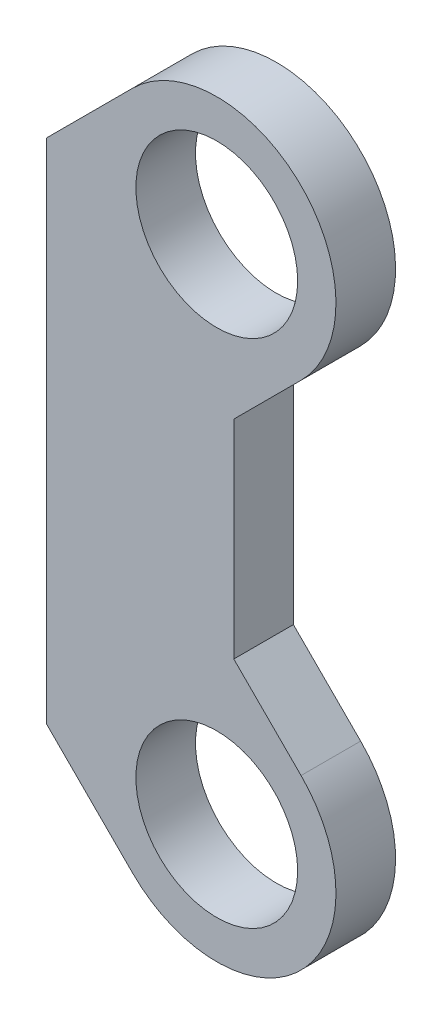
ISO-10303-21;
HEADER;
FILE_DESCRIPTION(('STEP AP214'),'2;1');
FILE_NAME('part.step','',(''),(''),'','','');
FILE_SCHEMA(('AUTOMOTIVE_DESIGN { 1 0 10303 214 1 1 1 1 }'));
ENDSEC;
DATA;
#1=APPLICATION_CONTEXT('core data for automotive mechanical design processes');
#2=APPLICATION_PROTOCOL_DEFINITION('international standard','automotive_design',2000,#1);
#3=PRODUCT_CONTEXT('',#1,'mechanical');
#4=PRODUCT('Part','Part','',(#3));
#5=PRODUCT_RELATED_PRODUCT_CATEGORY('part','',(#4));
#6=PRODUCT_DEFINITION_FORMATION('','',#4);
#7=PRODUCT_DEFINITION_CONTEXT('part definition',#1,'design');
#8=PRODUCT_DEFINITION('design','',#6,#7);
#9=PRODUCT_DEFINITION_SHAPE('','',#8);
#10=(LENGTH_UNIT() NAMED_UNIT(*) SI_UNIT(.MILLI.,.METRE.));
#11=(NAMED_UNIT(*) PLANE_ANGLE_UNIT() SI_UNIT($,.RADIAN.));
#12=(NAMED_UNIT(*) SI_UNIT($,.STERADIAN.) SOLID_ANGLE_UNIT());
#13=UNCERTAINTY_MEASURE_WITH_UNIT(LENGTH_MEASURE(1.E-05),#10,'distance_accuracy_value','');
#14=(GEOMETRIC_REPRESENTATION_CONTEXT(3) GLOBAL_UNCERTAINTY_ASSIGNED_CONTEXT((#13)) GLOBAL_UNIT_ASSIGNED_CONTEXT((#10,
#11,#12)) REPRESENTATION_CONTEXT('',''));
#15=CARTESIAN_POINT('',(0.,0.,0.));
#16=DIRECTION('',(0.,0.,1.));
#17=DIRECTION('',(1.,0.,0.));
#18=AXIS2_PLACEMENT_3D('',#15,#16,#17);
#19=CARTESIAN_POINT('',(-4.94974746830582,-4.94974746830584,3.5));
#20=DIRECTION('',(-0.707106781186546,-0.707106781186549,0.));
#21=DIRECTION('',(0.707106781186549,-0.707106781186546,0.));
#22=AXIS2_PLACEMENT_3D('',#19,#20,#21);
#23=PLANE('',#22);
#24=DIRECTION('',(-0.707106781186549,0.707106781186546,0.));
#25=VECTOR('',#24,1.);
#26=CARTESIAN_POINT('',(-4.94974746830582,-4.94974746830584,3.5));
#27=LINE('',#26,#25);
#28=CARTESIAN_POINT('',(-4.94974746830582,-4.94974746830584,3.5));
#29=VERTEX_POINT('',#28);
#30=CARTESIAN_POINT('',(-10.,0.100505063388337,3.5));
#31=VERTEX_POINT('',#30);
#32=EDGE_CURVE('E121',#29,#31,#27,.T.);
#33=ORIENTED_EDGE('',*,*,#32,.T.);
#34=DIRECTION('',(0.,0.,-1.));
#35=VECTOR('',#34,1.);
#36=CARTESIAN_POINT('',(-10.,0.10050506338834,3.5));
#37=LINE('',#36,#35);
#38=CARTESIAN_POINT('',(-10.,0.100505063388338,0.));
#39=VERTEX_POINT('',#38);
#40=EDGE_CURVE('E157',#31,#39,#37,.T.);
#41=ORIENTED_EDGE('',*,*,#40,.T.);
#42=DIRECTION('',(-0.707106781186549,0.707106781186546,0.));
#43=VECTOR('',#42,1.);
#44=CARTESIAN_POINT('',(-4.94974746830582,-4.94974746830584,0.));
#45=LINE('',#44,#43);
#46=CARTESIAN_POINT('',(-4.94974746830582,-4.94974746830584,0.));
#47=VERTEX_POINT('',#46);
#48=EDGE_CURVE('E164',#47,#39,#45,.T.);
#49=ORIENTED_EDGE('',*,*,#48,.F.);
#50=DIRECTION('',(0.,0.,-1.));
#51=VECTOR('',#50,1.);
#52=CARTESIAN_POINT('',(-4.94974746830582,-4.94974746830584,3.5));
#53=LINE('',#52,#51);
#54=EDGE_CURVE('E133',#29,#47,#53,.T.);
#55=ORIENTED_EDGE('',*,*,#54,.F.);
#56=EDGE_LOOP('',(#33,#41,#49,#55));
#57=FACE_BOUND('',#56,.T.);
#58=ADVANCED_FACE('F41',(#57),#23,.T.);
#59=CARTESIAN_POINT('',(0.,0.,3.5));
#60=DIRECTION('',(0.,0.,1.));
#61=DIRECTION('',(1.,0.,0.));
#62=AXIS2_PLACEMENT_3D('',#59,#60,#61);
#63=PLANE('',#62);
#64=CARTESIAN_POINT('',(0.,0.,3.5));
#65=DIRECTION('',(0.,0.,1.));
#66=DIRECTION('',(1.,0.,0.));
#67=AXIS2_PLACEMENT_3D('',#64,#65,#66);
#68=CIRCLE('',#67,4.75);
#69=CARTESIAN_POINT('',(4.75,0.,3.5));
#70=VERTEX_POINT('',#69);
#71=EDGE_CURVE('E140',#70,#70,#68,.T.);
#72=ORIENTED_EDGE('',*,*,#71,.F.);
#73=EDGE_LOOP('',(#72));
#74=FACE_BOUND('',#73,.T.);
#75=CARTESIAN_POINT('',(0.,30.,3.5));
#76=DIRECTION('',(0.,0.,1.));
#77=DIRECTION('',(1.,0.,0.));
#78=AXIS2_PLACEMENT_3D('',#75,#76,#77);
#79=CIRCLE('',#78,4.75);
#80=CARTESIAN_POINT('',(4.75,30.,3.5));
#81=VERTEX_POINT('',#80);
#82=EDGE_CURVE('E147',#81,#81,#79,.T.);
#83=ORIENTED_EDGE('',*,*,#82,.F.);
#84=EDGE_LOOP('',(#83));
#85=FACE_BOUND('',#84,.T.);
#86=DIRECTION('',(0.707106781186549,0.707106781186546,0.));
#87=VECTOR('',#86,1.);
#88=CARTESIAN_POINT('',(-19.9497474683058,19.9497474683059,3.5));
#89=LINE('',#88,#87);
#90=CARTESIAN_POINT('',(-10.,29.8994949366117,3.5));
#91=VERTEX_POINT('',#90);
#92=CARTESIAN_POINT('',(-4.94974746830582,34.9497474683058,3.5));
#93=VERTEX_POINT('',#92);
#94=EDGE_CURVE('E204',#91,#93,#89,.T.);
#95=ORIENTED_EDGE('',*,*,#94,.F.);
#96=DIRECTION('',(0.,-1.,0.));
#97=VECTOR('',#96,1.);
#98=CARTESIAN_POINT('',(-10.,29.8994949366117,3.5));
#99=LINE('',#98,#97);
#100=EDGE_CURVE('E220',#91,#31,#99,.T.);
#101=ORIENTED_EDGE('',*,*,#100,.T.);
#102=ORIENTED_EDGE('',*,*,#32,.F.);
#103=CARTESIAN_POINT('',(0.,0.,3.5));
#104=DIRECTION('',(0.,0.,1.));
#105=DIRECTION('',(1.,0.,0.));
#106=AXIS2_PLACEMENT_3D('',#103,#104,#105);
#107=CIRCLE('',#106,7.);
#108=CARTESIAN_POINT('',(4.94974746830582,4.94974746830584,3.5));
#109=VERTEX_POINT('',#108);
#110=EDGE_CURVE('E112',#29,#109,#107,.T.);
#111=ORIENTED_EDGE('',*,*,#110,.T.);
#112=DIRECTION('',(-0.707106781186549,0.707106781186546,0.));
#113=VECTOR('',#112,1.);
#114=CARTESIAN_POINT('',(4.94974746830582,4.94974746830585,3.5));
#115=LINE('',#114,#113);
#116=CARTESIAN_POINT('',(0.999999999999977,8.89949493661167,3.5));
#117=VERTEX_POINT('',#116);
#118=EDGE_CURVE('E117',#109,#117,#115,.T.);
#119=ORIENTED_EDGE('',*,*,#118,.T.);
#120=DIRECTION('',(0.,1.,0.));
#121=VECTOR('',#120,1.);
#122=CARTESIAN_POINT('',(0.999999999999977,0.,3.5));
#123=LINE('',#122,#121);
#124=CARTESIAN_POINT('',(0.999999999999977,21.1005050633883,3.5));
#125=VERTEX_POINT('',#124);
#126=EDGE_CURVE('E65',#117,#125,#123,.T.);
#127=ORIENTED_EDGE('',*,*,#126,.T.);
#128=DIRECTION('',(0.707106781186549,0.707106781186546,0.));
#129=VECTOR('',#128,1.);
#130=CARTESIAN_POINT('',(-10.0502525316942,10.0502525316942,3.5));
#131=LINE('',#130,#129);
#132=CARTESIAN_POINT('',(4.94974746830582,25.0502525316942,3.5));
#133=VERTEX_POINT('',#132);
#134=EDGE_CURVE('E183',#125,#133,#131,.T.);
#135=ORIENTED_EDGE('',*,*,#134,.T.);
#136=CARTESIAN_POINT('',(0.,30.,3.5));
#137=DIRECTION('',(0.,0.,1.));
#138=DIRECTION('',(1.,0.,0.));
#139=AXIS2_PLACEMENT_3D('',#136,#137,#138);
#140=CIRCLE('',#139,7.);
#141=EDGE_CURVE('E101',#133,#93,#140,.T.);
#142=ORIENTED_EDGE('',*,*,#141,.T.);
#143=EDGE_LOOP('',(#95,#101,#102,#111,#119,#127,#135,#142));
#144=FACE_BOUND('',#143,.T.);
#145=ADVANCED_FACE('F115',(#74,#85,#144),#63,.T.);
#146=CARTESIAN_POINT('',(0.,0.,0.));
#147=DIRECTION('',(0.,0.,1.));
#148=DIRECTION('',(1.,0.,0.));
#149=AXIS2_PLACEMENT_3D('',#146,#147,#148);
#150=PLANE('',#149);
#151=CARTESIAN_POINT('',(0.,30.,0.));
#152=DIRECTION('',(0.,0.,1.));
#153=DIRECTION('',(1.,0.,0.));
#154=AXIS2_PLACEMENT_3D('',#151,#152,#153);
#155=CIRCLE('',#154,4.75);
#156=CARTESIAN_POINT('',(4.75,30.,0.));
#157=VERTEX_POINT('',#156);
#158=EDGE_CURVE('E179',#157,#157,#155,.T.);
#159=ORIENTED_EDGE('',*,*,#158,.T.);
#160=EDGE_LOOP('',(#159));
#161=FACE_BOUND('',#160,.T.);
#162=CARTESIAN_POINT('',(0.,0.,0.));
#163=DIRECTION('',(0.,0.,1.));
#164=DIRECTION('',(1.,0.,0.));
#165=AXIS2_PLACEMENT_3D('',#162,#163,#164);
#166=CIRCLE('',#165,4.75);
#167=CARTESIAN_POINT('',(4.75,0.,0.));
#168=VERTEX_POINT('',#167);
#169=EDGE_CURVE('E175',#168,#168,#166,.T.);
#170=ORIENTED_EDGE('',*,*,#169,.T.);
#171=EDGE_LOOP('',(#170));
#172=FACE_BOUND('',#171,.T.);
#173=DIRECTION('',(0.,-1.,0.));
#174=VECTOR('',#173,1.);
#175=CARTESIAN_POINT('',(-10.,0.,0.));
#176=LINE('',#175,#174);
#177=CARTESIAN_POINT('',(-10.,29.8994949366117,0.));
#178=VERTEX_POINT('',#177);
#179=EDGE_CURVE('E11',#178,#39,#176,.T.);
#180=ORIENTED_EDGE('',*,*,#179,.F.);
#181=DIRECTION('',(0.707106781186549,0.707106781186546,0.));
#182=VECTOR('',#181,1.);
#183=CARTESIAN_POINT('',(-19.9497474683058,19.9497474683059,0.));
#184=LINE('',#183,#182);
#185=CARTESIAN_POINT('',(-4.94974746830582,34.9497474683058,0.));
#186=VERTEX_POINT('',#185);
#187=EDGE_CURVE('E161',#178,#186,#184,.T.);
#188=ORIENTED_EDGE('',*,*,#187,.T.);
#189=CARTESIAN_POINT('',(0.,30.,0.));
#190=DIRECTION('',(0.,0.,1.));
#191=DIRECTION('',(1.,0.,0.));
#192=AXIS2_PLACEMENT_3D('',#189,#190,#191);
#193=CIRCLE('',#192,7.);
#194=CARTESIAN_POINT('',(4.94974746830582,25.0502525316942,0.));
#195=VERTEX_POINT('',#194);
#196=EDGE_CURVE('E156',#195,#186,#193,.T.);
#197=ORIENTED_EDGE('',*,*,#196,.F.);
#198=DIRECTION('',(0.707106781186549,0.707106781186546,0.));
#199=VECTOR('',#198,1.);
#200=CARTESIAN_POINT('',(-10.0502525316942,10.0502525316942,0.));
#201=LINE('',#200,#199);
#202=CARTESIAN_POINT('',(0.999999999999977,21.1005050633883,0.));
#203=VERTEX_POINT('',#202);
#204=EDGE_CURVE('E152',#203,#195,#201,.T.);
#205=ORIENTED_EDGE('',*,*,#204,.F.);
#206=DIRECTION('',(0.,1.,0.));
#207=VECTOR('',#206,1.);
#208=CARTESIAN_POINT('',(0.999999999999977,0.,0.));
#209=LINE('',#208,#207);
#210=CARTESIAN_POINT('',(0.999999999999977,8.89949493661167,0.));
#211=VERTEX_POINT('',#210);
#212=EDGE_CURVE('E92',#211,#203,#209,.T.);
#213=ORIENTED_EDGE('',*,*,#212,.F.);
#214=DIRECTION('',(-0.707106781186549,0.707106781186546,0.));
#215=VECTOR('',#214,1.);
#216=CARTESIAN_POINT('',(4.94974746830582,4.94974746830585,0.));
#217=LINE('',#216,#215);
#218=CARTESIAN_POINT('',(4.94974746830582,4.94974746830584,0.));
#219=VERTEX_POINT('',#218);
#220=EDGE_CURVE('E170',#219,#211,#217,.T.);
#221=ORIENTED_EDGE('',*,*,#220,.F.);
#222=CARTESIAN_POINT('',(0.,0.,0.));
#223=DIRECTION('',(0.,0.,1.));
#224=DIRECTION('',(1.,0.,0.));
#225=AXIS2_PLACEMENT_3D('',#222,#223,#224);
#226=CIRCLE('',#225,7.);
#227=EDGE_CURVE('E129',#47,#219,#226,.T.);
#228=ORIENTED_EDGE('',*,*,#227,.F.);
#229=ORIENTED_EDGE('',*,*,#48,.T.);
#230=EDGE_LOOP('',(#180,#188,#197,#205,#213,#221,#228,#229));
#231=FACE_BOUND('',#230,.T.);
#232=ADVANCED_FACE('F200',(#161,#172,#231),#150,.F.);
#233=CARTESIAN_POINT('',(-10.0502525316942,10.0502525316942,3.5));
#234=DIRECTION('',(-0.707106781186546,0.707106781186549,0.));
#235=DIRECTION('',(-0.707106781186549,-0.707106781186546,0.));
#236=AXIS2_PLACEMENT_3D('',#233,#234,#235);
#237=PLANE('',#236);
#238=ORIENTED_EDGE('',*,*,#204,.T.);
#239=DIRECTION('',(0.,0.,-1.));
#240=VECTOR('',#239,1.);
#241=CARTESIAN_POINT('',(4.94974746830582,25.0502525316942,3.5));
#242=LINE('',#241,#240);
#243=EDGE_CURVE('E50',#133,#195,#242,.T.);
#244=ORIENTED_EDGE('',*,*,#243,.F.);
#245=ORIENTED_EDGE('',*,*,#134,.F.);
#246=DIRECTION('',(0.,0.,-1.));
#247=VECTOR('',#246,1.);
#248=CARTESIAN_POINT('',(0.999999999999977,21.1005050633883,3.5));
#249=LINE('',#248,#247);
#250=EDGE_CURVE('E151',#125,#203,#249,.T.);
#251=ORIENTED_EDGE('',*,*,#250,.T.);
#252=EDGE_LOOP('',(#238,#244,#245,#251));
#253=FACE_BOUND('',#252,.T.);
#254=ADVANCED_FACE('F43',(#253),#237,.F.);
#255=CARTESIAN_POINT('',(0.,30.,3.5));
#256=DIRECTION('',(0.,0.,-1.));
#257=DIRECTION('',(-1.,0.,0.));
#258=AXIS2_PLACEMENT_3D('',#255,#256,#257);
#259=CYLINDRICAL_SURFACE('',#258,7.);
#260=ORIENTED_EDGE('',*,*,#196,.T.);
#261=DIRECTION('',(0.,0.,-1.));
#262=VECTOR('',#261,1.);
#263=CARTESIAN_POINT('',(-4.94974746830582,34.9497474683058,3.5));
#264=LINE('',#263,#262);
#265=EDGE_CURVE('E190',#93,#186,#264,.T.);
#266=ORIENTED_EDGE('',*,*,#265,.F.);
#267=ORIENTED_EDGE('',*,*,#141,.F.);
#268=ORIENTED_EDGE('',*,*,#243,.T.);
#269=EDGE_LOOP('',(#260,#266,#267,#268));
#270=FACE_BOUND('',#269,.T.);
#271=ADVANCED_FACE('F195',(#270),#259,.T.);
#272=CARTESIAN_POINT('',(-19.9497474683058,19.9497474683059,3.5));
#273=DIRECTION('',(-0.707106781186546,0.707106781186549,0.));
#274=DIRECTION('',(-0.707106781186549,-0.707106781186546,0.));
#275=AXIS2_PLACEMENT_3D('',#272,#273,#274);
#276=PLANE('',#275);
#277=DIRECTION('',(0.,0.,1.));
#278=VECTOR('',#277,1.);
#279=CARTESIAN_POINT('',(-10.,29.8994949366117,-0.5));
#280=LINE('',#279,#278);
#281=EDGE_CURVE('E56',#178,#91,#280,.T.);
#282=ORIENTED_EDGE('',*,*,#281,.T.);
#283=ORIENTED_EDGE('',*,*,#94,.T.);
#284=ORIENTED_EDGE('',*,*,#265,.T.);
#285=ORIENTED_EDGE('',*,*,#187,.F.);
#286=EDGE_LOOP('',(#282,#283,#284,#285));
#287=FACE_BOUND('',#286,.T.);
#288=ADVANCED_FACE('F203',(#287),#276,.T.);
#289=CARTESIAN_POINT('',(0.,0.,3.5));
#290=DIRECTION('',(0.,0.,-1.));
#291=DIRECTION('',(-1.,0.,0.));
#292=AXIS2_PLACEMENT_3D('',#289,#290,#291);
#293=CYLINDRICAL_SURFACE('',#292,7.);
#294=ORIENTED_EDGE('',*,*,#227,.T.);
#295=DIRECTION('',(0.,0.,-1.));
#296=VECTOR('',#295,1.);
#297=CARTESIAN_POINT('',(4.94974746830582,4.94974746830584,3.5));
#298=LINE('',#297,#296);
#299=EDGE_CURVE('E126',#109,#219,#298,.T.);
#300=ORIENTED_EDGE('',*,*,#299,.F.);
#301=ORIENTED_EDGE('',*,*,#110,.F.);
#302=ORIENTED_EDGE('',*,*,#54,.T.);
#303=EDGE_LOOP('',(#294,#300,#301,#302));
#304=FACE_BOUND('',#303,.T.);
#305=ADVANCED_FACE('F127',(#304),#293,.T.);
#306=CARTESIAN_POINT('',(4.94974746830582,4.94974746830585,3.5));
#307=DIRECTION('',(-0.707106781186546,-0.707106781186549,0.));
#308=DIRECTION('',(0.707106781186549,-0.707106781186546,0.));
#309=AXIS2_PLACEMENT_3D('',#306,#307,#308);
#310=PLANE('',#309);
#311=ORIENTED_EDGE('',*,*,#220,.T.);
#312=DIRECTION('',(0.,0.,-1.));
#313=VECTOR('',#312,1.);
#314=CARTESIAN_POINT('',(0.999999999999977,8.89949493661167,3.5));
#315=LINE('',#314,#313);
#316=EDGE_CURVE('E134',#117,#211,#315,.T.);
#317=ORIENTED_EDGE('',*,*,#316,.F.);
#318=ORIENTED_EDGE('',*,*,#118,.F.);
#319=ORIENTED_EDGE('',*,*,#299,.T.);
#320=EDGE_LOOP('',(#311,#317,#318,#319));
#321=FACE_BOUND('',#320,.T.);
#322=ADVANCED_FACE('F136',(#321),#310,.F.);
#323=CARTESIAN_POINT('',(0.,0.,3.5));
#324=DIRECTION('',(0.,0.,-1.));
#325=DIRECTION('',(-1.,0.,0.));
#326=AXIS2_PLACEMENT_3D('',#323,#324,#325);
#327=CYLINDRICAL_SURFACE('',#326,4.75);
#328=ORIENTED_EDGE('',*,*,#71,.T.);
#329=EDGE_LOOP('',(#328));
#330=FACE_BOUND('',#329,.T.);
#331=ORIENTED_EDGE('',*,*,#169,.F.);
#332=EDGE_LOOP('',(#331));
#333=FACE_BOUND('',#332,.T.);
#334=ADVANCED_FACE('F260',(#330,#333),#327,.F.);
#335=CARTESIAN_POINT('',(0.999999999999977,0.,3.5));
#336=DIRECTION('',(-1.,0.,0.));
#337=DIRECTION('',(0.,0.,1.));
#338=AXIS2_PLACEMENT_3D('',#335,#336,#337);
#339=PLANE('',#338);
#340=ORIENTED_EDGE('',*,*,#212,.T.);
#341=ORIENTED_EDGE('',*,*,#250,.F.);
#342=ORIENTED_EDGE('',*,*,#126,.F.);
#343=ORIENTED_EDGE('',*,*,#316,.T.);
#344=EDGE_LOOP('',(#340,#341,#342,#343));
#345=FACE_BOUND('',#344,.T.);
#346=ADVANCED_FACE('F233',(#345),#339,.F.);
#347=CARTESIAN_POINT('',(0.,30.,3.5));
#348=DIRECTION('',(0.,0.,-1.));
#349=DIRECTION('',(-1.,0.,0.));
#350=AXIS2_PLACEMENT_3D('',#347,#348,#349);
#351=CYLINDRICAL_SURFACE('',#350,4.75);
#352=ORIENTED_EDGE('',*,*,#82,.T.);
#353=EDGE_LOOP('',(#352));
#354=FACE_BOUND('',#353,.T.);
#355=ORIENTED_EDGE('',*,*,#158,.F.);
#356=EDGE_LOOP('',(#355));
#357=FACE_BOUND('',#356,.T.);
#358=ADVANCED_FACE('F228',(#354,#357),#351,.F.);
#359=CARTESIAN_POINT('',(-10.,29.8994949366117,-0.5));
#360=DIRECTION('',(-1.,0.,0.));
#361=DIRECTION('',(0.,-1.,0.));
#362=AXIS2_PLACEMENT_3D('',#359,#360,#361);
#363=PLANE('',#362);
#364=ORIENTED_EDGE('',*,*,#100,.F.);
#365=ORIENTED_EDGE('',*,*,#281,.F.);
#366=ORIENTED_EDGE('',*,*,#179,.T.);
#367=ORIENTED_EDGE('',*,*,#40,.F.);
#368=EDGE_LOOP('',(#364,#365,#366,#367));
#369=FACE_BOUND('',#368,.T.);
#370=ADVANCED_FACE('F221',(#369),#363,.T.);
#371=CLOSED_SHELL('',(#58,#145,#232,#254,#271,#288,#305,#322,#334,#346,#358,#370));
#372=MANIFOLD_SOLID_BREP('B2',#371);
#373=ADVANCED_BREP_SHAPE_REPRESENTATION('',(#18,#372),#14);
#374=SHAPE_DEFINITION_REPRESENTATION(#9,#373);
ENDSEC;
END-ISO-10303-21;
